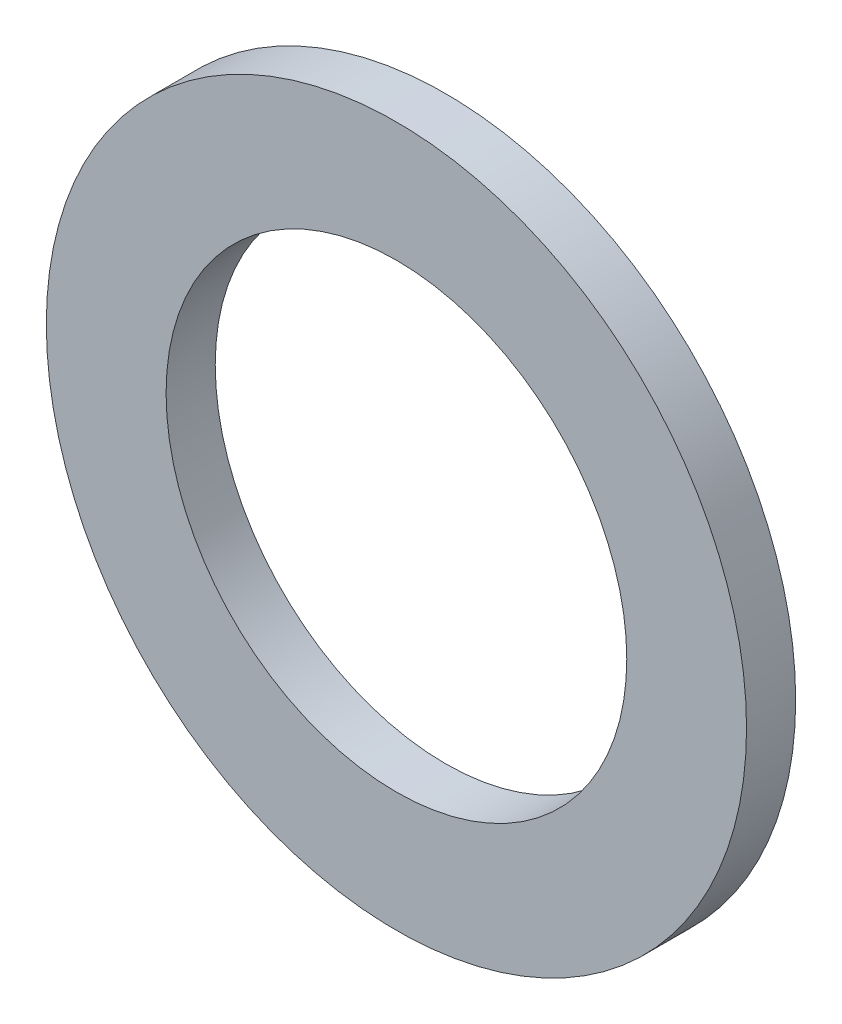
ISO-10303-21;
HEADER;
FILE_DESCRIPTION(('STEP AP214'),'2;1');
FILE_NAME('part.step','',(''),(''),'','','');
FILE_SCHEMA(('AUTOMOTIVE_DESIGN { 1 0 10303 214 1 1 1 1 }'));
ENDSEC;
DATA;
#1=APPLICATION_CONTEXT('core data for automotive mechanical design processes');
#2=APPLICATION_PROTOCOL_DEFINITION('international standard','automotive_design',2000,#1);
#3=PRODUCT_CONTEXT('',#1,'mechanical');
#4=PRODUCT('Part','Part','',(#3));
#5=PRODUCT_RELATED_PRODUCT_CATEGORY('part','',(#4));
#6=PRODUCT_DEFINITION_FORMATION('','',#4);
#7=PRODUCT_DEFINITION_CONTEXT('part definition',#1,'design');
#8=PRODUCT_DEFINITION('design','',#6,#7);
#9=PRODUCT_DEFINITION_SHAPE('','',#8);
#10=(LENGTH_UNIT() NAMED_UNIT(*) SI_UNIT(.MILLI.,.METRE.));
#11=(NAMED_UNIT(*) PLANE_ANGLE_UNIT() SI_UNIT($,.RADIAN.));
#12=(NAMED_UNIT(*) SI_UNIT($,.STERADIAN.) SOLID_ANGLE_UNIT());
#13=UNCERTAINTY_MEASURE_WITH_UNIT(LENGTH_MEASURE(1.E-05),#10,'distance_accuracy_value','');
#14=(GEOMETRIC_REPRESENTATION_CONTEXT(3) GLOBAL_UNCERTAINTY_ASSIGNED_CONTEXT((#13)) GLOBAL_UNIT_ASSIGNED_CONTEXT((#10,
#11,#12)) REPRESENTATION_CONTEXT('',''));
#15=CARTESIAN_POINT('',(0.,0.,0.));
#16=DIRECTION('',(0.,0.,1.));
#17=DIRECTION('',(1.,0.,0.));
#18=AXIS2_PLACEMENT_3D('',#15,#16,#17);
#19=CARTESIAN_POINT('',(0.,0.,1.016));
#20=DIRECTION('',(0.,0.,1.));
#21=DIRECTION('',(1.,0.,0.));
#22=AXIS2_PLACEMENT_3D('',#19,#20,#21);
#23=PLANE('',#22);
#24=CARTESIAN_POINT('',(0.,0.,1.016));
#25=DIRECTION('',(0.,0.,1.));
#26=DIRECTION('',(1.,0.,0.));
#27=AXIS2_PLACEMENT_3D('',#24,#25,#26);
#28=CIRCLE('',#27,7.239);
#29=CARTESIAN_POINT('',(7.239,0.,1.016));
#30=VERTEX_POINT('',#29);
#31=EDGE_CURVE('E10',#30,#30,#28,.T.);
#32=ORIENTED_EDGE('',*,*,#31,.T.);
#33=EDGE_LOOP('',(#32));
#34=FACE_BOUND('',#33,.T.);
#35=CARTESIAN_POINT('',(0.,0.,1.016));
#36=DIRECTION('',(0.,0.,1.));
#37=DIRECTION('',(1.,0.,0.));
#38=AXIS2_PLACEMENT_3D('',#35,#36,#37);
#39=CIRCLE('',#38,4.7625);
#40=CARTESIAN_POINT('',(4.7625,0.,1.016));
#41=VERTEX_POINT('',#40);
#42=EDGE_CURVE('E43',#41,#41,#39,.T.);
#43=ORIENTED_EDGE('',*,*,#42,.F.);
#44=EDGE_LOOP('',(#43));
#45=FACE_BOUND('',#44,.T.);
#46=ADVANCED_FACE('F32',(#34,#45),#23,.T.);
#47=CARTESIAN_POINT('',(0.,0.,0.));
#48=DIRECTION('',(0.,0.,1.));
#49=DIRECTION('',(1.,0.,0.));
#50=AXIS2_PLACEMENT_3D('',#47,#48,#49);
#51=PLANE('',#50);
#52=CARTESIAN_POINT('',(0.,0.,0.));
#53=DIRECTION('',(0.,0.,1.));
#54=DIRECTION('',(1.,0.,0.));
#55=AXIS2_PLACEMENT_3D('',#52,#53,#54);
#56=CIRCLE('',#55,7.239);
#57=CARTESIAN_POINT('',(7.239,0.,0.));
#58=VERTEX_POINT('',#57);
#59=EDGE_CURVE('E36',#58,#58,#56,.T.);
#60=ORIENTED_EDGE('',*,*,#59,.F.);
#61=EDGE_LOOP('',(#60));
#62=FACE_BOUND('',#61,.T.);
#63=CARTESIAN_POINT('',(0.,0.,0.));
#64=DIRECTION('',(0.,0.,1.));
#65=DIRECTION('',(1.,0.,0.));
#66=AXIS2_PLACEMENT_3D('',#63,#64,#65);
#67=CIRCLE('',#66,4.7625);
#68=CARTESIAN_POINT('',(4.7625,0.,0.));
#69=VERTEX_POINT('',#68);
#70=EDGE_CURVE('E45',#69,#69,#67,.T.);
#71=ORIENTED_EDGE('',*,*,#70,.T.);
#72=EDGE_LOOP('',(#71));
#73=FACE_BOUND('',#72,.T.);
#74=ADVANCED_FACE('F55',(#62,#73),#51,.F.);
#75=CARTESIAN_POINT('',(0.,0.,1.016));
#76=DIRECTION('',(0.,0.,-1.));
#77=DIRECTION('',(-1.,0.,0.));
#78=AXIS2_PLACEMENT_3D('',#75,#76,#77);
#79=CYLINDRICAL_SURFACE('',#78,7.239);
#80=ORIENTED_EDGE('',*,*,#31,.F.);
#81=EDGE_LOOP('',(#80));
#82=FACE_BOUND('',#81,.T.);
#83=ORIENTED_EDGE('',*,*,#59,.T.);
#84=EDGE_LOOP('',(#83));
#85=FACE_BOUND('',#84,.T.);
#86=ADVANCED_FACE('F34',(#82,#85),#79,.T.);
#87=CARTESIAN_POINT('',(0.,0.,1.016));
#88=DIRECTION('',(0.,0.,-1.));
#89=DIRECTION('',(-1.,0.,0.));
#90=AXIS2_PLACEMENT_3D('',#87,#88,#89);
#91=CYLINDRICAL_SURFACE('',#90,4.7625);
#92=ORIENTED_EDGE('',*,*,#42,.T.);
#93=EDGE_LOOP('',(#92));
#94=FACE_BOUND('',#93,.T.);
#95=ORIENTED_EDGE('',*,*,#70,.F.);
#96=EDGE_LOOP('',(#95));
#97=FACE_BOUND('',#96,.T.);
#98=ADVANCED_FACE('F51',(#94,#97),#91,.F.);
#99=CLOSED_SHELL('',(#46,#74,#86,#98));
#100=MANIFOLD_SOLID_BREP('B2',#99);
#101=ADVANCED_BREP_SHAPE_REPRESENTATION('',(#18,#100),#14);
#102=SHAPE_DEFINITION_REPRESENTATION(#9,#101);
ENDSEC;
END-ISO-10303-21;
